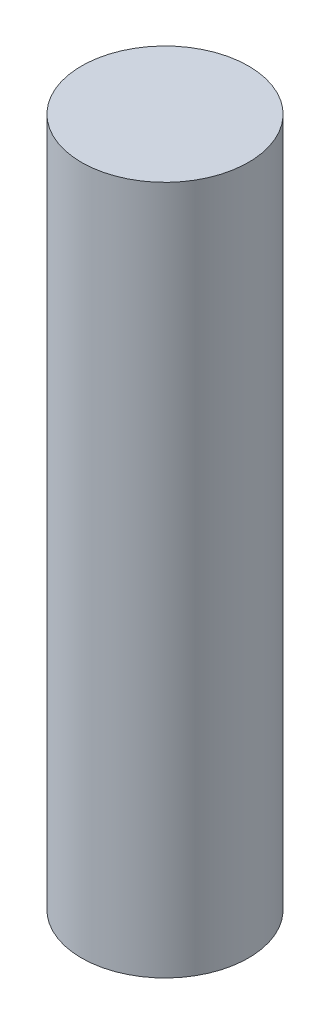
ISO-10303-21;
HEADER;
FILE_DESCRIPTION(('STEP AP214'),'2;1');
FILE_NAME('part.step','',(''),(''),'','','');
FILE_SCHEMA(('AUTOMOTIVE_DESIGN { 1 0 10303 214 1 1 1 1 }'));
ENDSEC;
DATA;
#1=APPLICATION_CONTEXT('core data for automotive mechanical design processes');
#2=APPLICATION_PROTOCOL_DEFINITION('international standard','automotive_design',2000,#1);
#3=PRODUCT_CONTEXT('',#1,'mechanical');
#4=PRODUCT('Part','Part','',(#3));
#5=PRODUCT_RELATED_PRODUCT_CATEGORY('part','',(#4));
#6=PRODUCT_DEFINITION_FORMATION('','',#4);
#7=PRODUCT_DEFINITION_CONTEXT('part definition',#1,'design');
#8=PRODUCT_DEFINITION('design','',#6,#7);
#9=PRODUCT_DEFINITION_SHAPE('','',#8);
#10=(LENGTH_UNIT() NAMED_UNIT(*) SI_UNIT(.MILLI.,.METRE.));
#11=(NAMED_UNIT(*) PLANE_ANGLE_UNIT() SI_UNIT($,.RADIAN.));
#12=(NAMED_UNIT(*) SI_UNIT($,.STERADIAN.) SOLID_ANGLE_UNIT());
#13=UNCERTAINTY_MEASURE_WITH_UNIT(LENGTH_MEASURE(1.E-05),#10,'distance_accuracy_value','');
#14=(GEOMETRIC_REPRESENTATION_CONTEXT(3) GLOBAL_UNCERTAINTY_ASSIGNED_CONTEXT((#13)) GLOBAL_UNIT_ASSIGNED_CONTEXT((#10,
#11,#12)) REPRESENTATION_CONTEXT('',''));
#15=CARTESIAN_POINT('',(0.,0.,0.));
#16=DIRECTION('',(0.,0.,1.));
#17=DIRECTION('',(1.,0.,0.));
#18=AXIS2_PLACEMENT_3D('',#15,#16,#17);
#19=CARTESIAN_POINT('',(0.,30.6444444444444,-4.));
#20=DIRECTION('',(0.,-1.,0.));
#21=DIRECTION('',(0.,0.,-1.));
#22=AXIS2_PLACEMENT_3D('',#19,#20,#21);
#23=PLANE('',#22);
#24=CARTESIAN_POINT('',(0.,30.6444444444444,0.));
#25=DIRECTION('',(0.,1.,0.));
#26=DIRECTION('',(0.,0.,1.));
#27=AXIS2_PLACEMENT_3D('',#24,#25,#26);
#28=CIRCLE('',#27,4.);
#29=CARTESIAN_POINT('',(0.,30.6444444444444,4.));
#30=VERTEX_POINT('',#29);
#31=EDGE_CURVE('E44',#30,#30,#28,.T.);
#32=ORIENTED_EDGE('',*,*,#31,.T.);
#33=EDGE_LOOP('',(#32));
#34=FACE_BOUND('',#33,.T.);
#35=ADVANCED_FACE('F37',(#34),#23,.F.);
#36=CARTESIAN_POINT('',(0.,-2.35555555555555,-4.));
#37=DIRECTION('',(0.,1.,0.));
#38=DIRECTION('',(0.,0.,1.));
#39=AXIS2_PLACEMENT_3D('',#36,#37,#38);
#40=PLANE('',#39);
#41=CARTESIAN_POINT('',(0.,-2.35555555555555,0.));
#42=DIRECTION('',(0.,1.,0.));
#43=DIRECTION('',(0.,0.,1.));
#44=AXIS2_PLACEMENT_3D('',#41,#42,#43);
#45=CIRCLE('',#44,4.);
#46=CARTESIAN_POINT('',(0.,-2.35555555555555,4.));
#47=VERTEX_POINT('',#46);
#48=EDGE_CURVE('E10',#47,#47,#45,.T.);
#49=ORIENTED_EDGE('',*,*,#48,.F.);
#50=EDGE_LOOP('',(#49));
#51=FACE_BOUND('',#50,.T.);
#52=ADVANCED_FACE('F54',(#51),#40,.F.);
#53=CARTESIAN_POINT('',(0.,6.48888888888888,0.));
#54=DIRECTION('',(0.,1.,0.));
#55=DIRECTION('',(0.,0.,1.));
#56=AXIS2_PLACEMENT_3D('',#53,#54,#55);
#57=CYLINDRICAL_SURFACE('',#56,4.);
#58=ORIENTED_EDGE('',*,*,#31,.F.);
#59=EDGE_LOOP('',(#58));
#60=FACE_BOUND('',#59,.T.);
#61=ORIENTED_EDGE('',*,*,#48,.T.);
#62=EDGE_LOOP('',(#61));
#63=FACE_BOUND('',#62,.T.);
#64=ADVANCED_FACE('F52',(#60,#63),#57,.T.);
#65=CLOSED_SHELL('',(#35,#52,#64));
#66=MANIFOLD_SOLID_BREP('B2',#65);
#67=ADVANCED_BREP_SHAPE_REPRESENTATION('',(#18,#66),#14);
#68=SHAPE_DEFINITION_REPRESENTATION(#9,#67);
ENDSEC;
END-ISO-10303-21;
